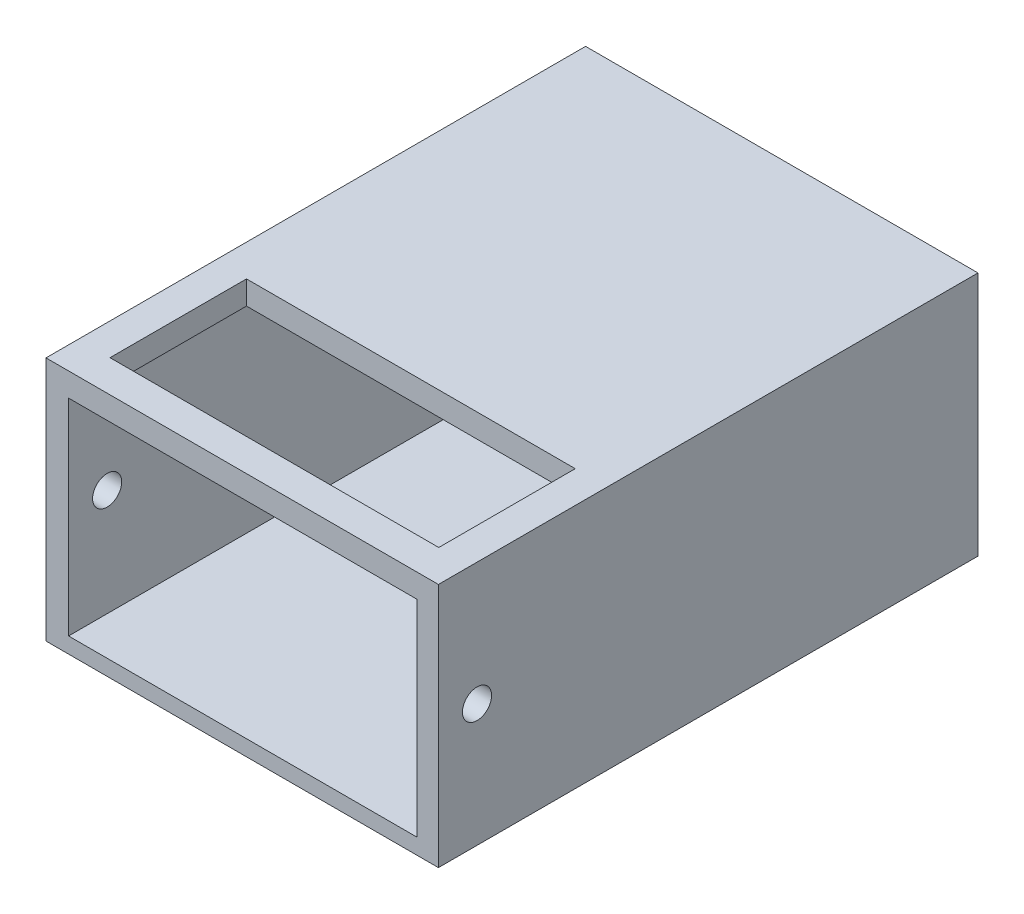
ISO-10303-21;
HEADER;
FILE_DESCRIPTION(('STEP AP214'),'2;1');
FILE_NAME('part.step','',(''),(''),'','','');
FILE_SCHEMA(('AUTOMOTIVE_DESIGN { 1 0 10303 214 1 1 1 1 }'));
ENDSEC;
DATA;
#1=APPLICATION_CONTEXT('core data for automotive mechanical design processes');
#2=APPLICATION_PROTOCOL_DEFINITION('international standard','automotive_design',2000,#1);
#3=PRODUCT_CONTEXT('',#1,'mechanical');
#4=PRODUCT('Part','Part','',(#3));
#5=PRODUCT_RELATED_PRODUCT_CATEGORY('part','',(#4));
#6=PRODUCT_DEFINITION_FORMATION('','',#4);
#7=PRODUCT_DEFINITION_CONTEXT('part definition',#1,'design');
#8=PRODUCT_DEFINITION('design','',#6,#7);
#9=PRODUCT_DEFINITION_SHAPE('','',#8);
#10=(LENGTH_UNIT() NAMED_UNIT(*) SI_UNIT(.MILLI.,.METRE.));
#11=(NAMED_UNIT(*) PLANE_ANGLE_UNIT() SI_UNIT($,.RADIAN.));
#12=(NAMED_UNIT(*) SI_UNIT($,.STERADIAN.) SOLID_ANGLE_UNIT());
#13=UNCERTAINTY_MEASURE_WITH_UNIT(LENGTH_MEASURE(1.E-05),#10,'distance_accuracy_value','');
#14=(GEOMETRIC_REPRESENTATION_CONTEXT(3) GLOBAL_UNCERTAINTY_ASSIGNED_CONTEXT((#13)) GLOBAL_UNIT_ASSIGNED_CONTEXT((#10,
#11,#12)) REPRESENTATION_CONTEXT('',''));
#15=CARTESIAN_POINT('',(0.,0.,0.));
#16=DIRECTION('',(0.,0.,1.));
#17=DIRECTION('',(1.,0.,0.));
#18=AXIS2_PLACEMENT_3D('',#15,#16,#17);
#19=CARTESIAN_POINT('',(20.,25.,-27.5));
#20=DIRECTION('',(-1.,0.,0.));
#21=DIRECTION('',(0.,0.,1.));
#22=AXIS2_PLACEMENT_3D('',#19,#20,#21);
#23=PLANE('',#22);
#24=CARTESIAN_POINT('',(20.,12.5,23.5669512691688));
#25=DIRECTION('',(-1.,0.,0.));
#26=DIRECTION('',(0.,0.,1.));
#27=AXIS2_PLACEMENT_3D('',#24,#25,#26);
#28=CIRCLE('',#27,1.48514544680534);
#29=CARTESIAN_POINT('',(20.,12.5,25.0520967159742));
#30=VERTEX_POINT('',#29);
#31=EDGE_CURVE('E178',#30,#30,#28,.T.);
#32=ORIENTED_EDGE('',*,*,#31,.T.);
#33=EDGE_LOOP('',(#32));
#34=FACE_BOUND('',#33,.T.);
#35=DIRECTION('',(0.,0.,-1.));
#36=VECTOR('',#35,1.);
#37=CARTESIAN_POINT('',(20.,0.,-27.5));
#38=LINE('',#37,#36);
#39=CARTESIAN_POINT('',(20.,0.,27.5));
#40=VERTEX_POINT('',#39);
#41=CARTESIAN_POINT('',(20.,0.,-27.5));
#42=VERTEX_POINT('',#41);
#43=EDGE_CURVE('E217',#40,#42,#38,.T.);
#44=ORIENTED_EDGE('',*,*,#43,.T.);
#45=DIRECTION('',(0.,-1.,0.));
#46=VECTOR('',#45,1.);
#47=CARTESIAN_POINT('',(20.,25.,-27.5));
#48=LINE('',#47,#46);
#49=CARTESIAN_POINT('',(20.,25.,-27.5));
#50=VERTEX_POINT('',#49);
#51=EDGE_CURVE('E264',#50,#42,#48,.T.);
#52=ORIENTED_EDGE('',*,*,#51,.F.);
#53=DIRECTION('',(0.,0.,-1.));
#54=VECTOR('',#53,1.);
#55=CARTESIAN_POINT('',(20.,25.,-27.5));
#56=LINE('',#55,#54);
#57=CARTESIAN_POINT('',(20.,25.,27.5));
#58=VERTEX_POINT('',#57);
#59=EDGE_CURVE('E227',#58,#50,#56,.T.);
#60=ORIENTED_EDGE('',*,*,#59,.F.);
#61=DIRECTION('',(0.,-1.,0.));
#62=VECTOR('',#61,1.);
#63=CARTESIAN_POINT('',(20.,25.,27.5));
#64=LINE('',#63,#62);
#65=EDGE_CURVE('E241',#58,#40,#64,.T.);
#66=ORIENTED_EDGE('',*,*,#65,.T.);
#67=EDGE_LOOP('',(#44,#52,#60,#66));
#68=FACE_BOUND('',#67,.T.);
#69=ADVANCED_FACE('F45',(#34,#68),#23,.F.);
#70=CARTESIAN_POINT('',(-20.,25.,-27.5));
#71=DIRECTION('',(0.,0.,1.));
#72=DIRECTION('',(1.,0.,0.));
#73=AXIS2_PLACEMENT_3D('',#70,#71,#72);
#74=PLANE('',#73);
#75=DIRECTION('',(-1.,0.,0.));
#76=VECTOR('',#75,1.);
#77=CARTESIAN_POINT('',(-20.,0.,-27.5));
#78=LINE('',#77,#76);
#79=CARTESIAN_POINT('',(-20.,0.,-27.5));
#80=VERTEX_POINT('',#79);
#81=EDGE_CURVE('E245',#42,#80,#78,.T.);
#82=ORIENTED_EDGE('',*,*,#81,.T.);
#83=DIRECTION('',(0.,-1.,0.));
#84=VECTOR('',#83,1.);
#85=CARTESIAN_POINT('',(-20.,25.,-27.5));
#86=LINE('',#85,#84);
#87=CARTESIAN_POINT('',(-20.,25.,-27.5));
#88=VERTEX_POINT('',#87);
#89=EDGE_CURVE('E260',#88,#80,#86,.T.);
#90=ORIENTED_EDGE('',*,*,#89,.F.);
#91=DIRECTION('',(-1.,0.,0.));
#92=VECTOR('',#91,1.);
#93=CARTESIAN_POINT('',(-20.,25.,-27.5));
#94=LINE('',#93,#92);
#95=EDGE_CURVE('E231',#50,#88,#94,.T.);
#96=ORIENTED_EDGE('',*,*,#95,.F.);
#97=ORIENTED_EDGE('',*,*,#51,.T.);
#98=EDGE_LOOP('',(#82,#90,#96,#97));
#99=FACE_BOUND('',#98,.T.);
#100=ADVANCED_FACE('F298',(#99),#74,.F.);
#101=CARTESIAN_POINT('',(-20.,25.,-27.5));
#102=DIRECTION('',(1.,0.,0.));
#103=DIRECTION('',(0.,0.,-1.));
#104=AXIS2_PLACEMENT_3D('',#101,#102,#103);
#105=PLANE('',#104);
#106=CARTESIAN_POINT('',(-20.,12.5,23.5669512691688));
#107=DIRECTION('',(-1.,0.,0.));
#108=DIRECTION('',(0.,0.,1.));
#109=AXIS2_PLACEMENT_3D('',#106,#107,#108);
#110=CIRCLE('',#109,1.48514544680534);
#111=CARTESIAN_POINT('',(-20.,12.5,25.0520967159742));
#112=VERTEX_POINT('',#111);
#113=EDGE_CURVE('E165',#112,#112,#110,.T.);
#114=ORIENTED_EDGE('',*,*,#113,.F.);
#115=EDGE_LOOP('',(#114));
#116=FACE_BOUND('',#115,.T.);
#117=DIRECTION('',(0.,0.,1.));
#118=VECTOR('',#117,1.);
#119=CARTESIAN_POINT('',(-20.,0.,-27.5));
#120=LINE('',#119,#118);
#121=CARTESIAN_POINT('',(-20.,0.,27.5));
#122=VERTEX_POINT('',#121);
#123=EDGE_CURVE('E248',#80,#122,#120,.T.);
#124=ORIENTED_EDGE('',*,*,#123,.T.);
#125=DIRECTION('',(0.,-1.,0.));
#126=VECTOR('',#125,1.);
#127=CARTESIAN_POINT('',(-20.,25.,27.5));
#128=LINE('',#127,#126);
#129=CARTESIAN_POINT('',(-20.,25.,27.5));
#130=VERTEX_POINT('',#129);
#131=EDGE_CURVE('E256',#130,#122,#128,.T.);
#132=ORIENTED_EDGE('',*,*,#131,.F.);
#133=DIRECTION('',(0.,0.,1.));
#134=VECTOR('',#133,1.);
#135=CARTESIAN_POINT('',(-20.,25.,-27.5));
#136=LINE('',#135,#134);
#137=EDGE_CURVE('E235',#88,#130,#136,.T.);
#138=ORIENTED_EDGE('',*,*,#137,.F.);
#139=ORIENTED_EDGE('',*,*,#89,.T.);
#140=EDGE_LOOP('',(#124,#132,#138,#139));
#141=FACE_BOUND('',#140,.T.);
#142=ADVANCED_FACE('F305',(#116,#141),#105,.F.);
#143=CARTESIAN_POINT('',(-20.,25.,27.5));
#144=DIRECTION('',(0.,0.,-1.));
#145=DIRECTION('',(-1.,0.,0.));
#146=AXIS2_PLACEMENT_3D('',#143,#144,#145);
#147=PLANE('',#146);
#148=DIRECTION('',(-1.,0.,0.));
#149=VECTOR('',#148,1.);
#150=CARTESIAN_POINT('',(-17.7,22.6,27.5));
#151=LINE('',#150,#149);
#152=CARTESIAN_POINT('',(17.8,22.6,27.5));
#153=VERTEX_POINT('',#152);
#154=CARTESIAN_POINT('',(-17.7,22.6,27.5));
#155=VERTEX_POINT('',#154);
#156=EDGE_CURVE('E203',#153,#155,#151,.T.);
#157=ORIENTED_EDGE('',*,*,#156,.F.);
#158=DIRECTION('',(0.,1.,0.));
#159=VECTOR('',#158,1.);
#160=CARTESIAN_POINT('',(17.8,22.6,27.5));
#161=LINE('',#160,#159);
#162=CARTESIAN_POINT('',(17.8,1.6,27.5));
#163=VERTEX_POINT('',#162);
#164=EDGE_CURVE('E182',#163,#153,#161,.T.);
#165=ORIENTED_EDGE('',*,*,#164,.F.);
#166=DIRECTION('',(1.,0.,0.));
#167=VECTOR('',#166,1.);
#168=CARTESIAN_POINT('',(-17.7,1.6,27.5));
#169=LINE('',#168,#167);
#170=CARTESIAN_POINT('',(-17.7,1.6,27.5));
#171=VERTEX_POINT('',#170);
#172=EDGE_CURVE('E188',#171,#163,#169,.T.);
#173=ORIENTED_EDGE('',*,*,#172,.F.);
#174=DIRECTION('',(0.,-1.,0.));
#175=VECTOR('',#174,1.);
#176=CARTESIAN_POINT('',(-17.7,22.6,27.5));
#177=LINE('',#176,#175);
#178=EDGE_CURVE('E207',#155,#171,#177,.T.);
#179=ORIENTED_EDGE('',*,*,#178,.F.);
#180=EDGE_LOOP('',(#157,#165,#173,#179));
#181=FACE_BOUND('',#180,.T.);
#182=DIRECTION('',(1.,0.,0.));
#183=VECTOR('',#182,1.);
#184=CARTESIAN_POINT('',(-20.,0.,27.5));
#185=LINE('',#184,#183);
#186=EDGE_CURVE('E232',#122,#40,#185,.T.);
#187=ORIENTED_EDGE('',*,*,#186,.T.);
#188=ORIENTED_EDGE('',*,*,#65,.F.);
#189=DIRECTION('',(1.,0.,0.));
#190=VECTOR('',#189,1.);
#191=CARTESIAN_POINT('',(-20.,25.,27.5));
#192=LINE('',#191,#190);
#193=EDGE_CURVE('E238',#130,#58,#192,.T.);
#194=ORIENTED_EDGE('',*,*,#193,.F.);
#195=ORIENTED_EDGE('',*,*,#131,.T.);
#196=EDGE_LOOP('',(#187,#188,#194,#195));
#197=FACE_BOUND('',#196,.T.);
#198=ADVANCED_FACE('F322',(#181,#197),#147,.F.);
#199=CARTESIAN_POINT('',(0.,25.,0.));
#200=DIRECTION('',(0.,1.,0.));
#201=DIRECTION('',(0.,0.,1.));
#202=AXIS2_PLACEMENT_3D('',#199,#200,#201);
#203=PLANE('',#202);
#204=DIRECTION('',(0.,0.,-1.));
#205=VECTOR('',#204,1.);
#206=CARTESIAN_POINT('',(16.7550361228076,25.,10.3075285514993));
#207=LINE('',#206,#205);
#208=CARTESIAN_POINT('',(16.7550361228076,25.,24.2205712053749));
#209=VERTEX_POINT('',#208);
#210=CARTESIAN_POINT('',(16.7550361228076,25.,10.3075285514993));
#211=VERTEX_POINT('',#210);
#212=EDGE_CURVE('E60',#209,#211,#207,.T.);
#213=ORIENTED_EDGE('',*,*,#212,.F.);
#214=DIRECTION('',(1.,0.,0.));
#215=VECTOR('',#214,1.);
#216=CARTESIAN_POINT('',(-16.7550361228076,25.,24.2205712053749));
#217=LINE('',#216,#215);
#218=CARTESIAN_POINT('',(-16.7550361228076,25.,24.2205712053749));
#219=VERTEX_POINT('',#218);
#220=EDGE_CURVE('E155',#219,#209,#217,.T.);
#221=ORIENTED_EDGE('',*,*,#220,.F.);
#222=DIRECTION('',(0.,0.,1.));
#223=VECTOR('',#222,1.);
#224=CARTESIAN_POINT('',(-16.7550361228076,25.,10.3075285514993));
#225=LINE('',#224,#223);
#226=CARTESIAN_POINT('',(-16.7550361228076,25.,10.3075285514993));
#227=VERTEX_POINT('',#226);
#228=EDGE_CURVE('E137',#227,#219,#225,.T.);
#229=ORIENTED_EDGE('',*,*,#228,.F.);
#230=DIRECTION('',(-1.,0.,0.));
#231=VECTOR('',#230,1.);
#232=CARTESIAN_POINT('',(-16.7550361228076,25.,10.3075285514993));
#233=LINE('',#232,#231);
#234=EDGE_CURVE('E147',#211,#227,#233,.T.);
#235=ORIENTED_EDGE('',*,*,#234,.F.);
#236=EDGE_LOOP('',(#213,#221,#229,#235));
#237=FACE_BOUND('',#236,.T.);
#238=ORIENTED_EDGE('',*,*,#59,.T.);
#239=ORIENTED_EDGE('',*,*,#95,.T.);
#240=ORIENTED_EDGE('',*,*,#137,.T.);
#241=ORIENTED_EDGE('',*,*,#193,.T.);
#242=EDGE_LOOP('',(#238,#239,#240,#241));
#243=FACE_BOUND('',#242,.T.);
#244=ADVANCED_FACE('F152',(#237,#243),#203,.T.);
#245=CARTESIAN_POINT('',(0.,0.,0.));
#246=DIRECTION('',(0.,1.,0.));
#247=DIRECTION('',(0.,0.,1.));
#248=AXIS2_PLACEMENT_3D('',#245,#246,#247);
#249=PLANE('',#248);
#250=ORIENTED_EDGE('',*,*,#43,.F.);
#251=ORIENTED_EDGE('',*,*,#186,.F.);
#252=ORIENTED_EDGE('',*,*,#123,.F.);
#253=ORIENTED_EDGE('',*,*,#81,.F.);
#254=EDGE_LOOP('',(#250,#251,#252,#253));
#255=FACE_BOUND('',#254,.T.);
#256=ADVANCED_FACE('F315',(#255),#249,.F.);
#257=CARTESIAN_POINT('',(17.8,22.6,-25.));
#258=DIRECTION('',(1.,0.,0.));
#259=DIRECTION('',(0.,1.,0.));
#260=AXIS2_PLACEMENT_3D('',#257,#258,#259);
#261=PLANE('',#260);
#262=CARTESIAN_POINT('',(17.8,12.5,23.5669512691688));
#263=DIRECTION('',(1.,0.,0.));
#264=DIRECTION('',(0.,1.,0.));
#265=AXIS2_PLACEMENT_3D('',#262,#263,#264);
#266=CIRCLE('',#265,1.48514544680534);
#267=CARTESIAN_POINT('',(17.8,13.9851454468053,23.5669512691688));
#268=VERTEX_POINT('',#267);
#269=EDGE_CURVE('E174',#268,#268,#266,.T.);
#270=ORIENTED_EDGE('',*,*,#269,.T.);
#271=EDGE_LOOP('',(#270));
#272=FACE_BOUND('',#271,.T.);
#273=ORIENTED_EDGE('',*,*,#164,.T.);
#274=DIRECTION('',(0.,0.,1.));
#275=VECTOR('',#274,1.);
#276=CARTESIAN_POINT('',(17.8,22.6,-25.));
#277=LINE('',#276,#275);
#278=CARTESIAN_POINT('',(17.8,22.6,-25.));
#279=VERTEX_POINT('',#278);
#280=EDGE_CURVE('E200',#279,#153,#277,.T.);
#281=ORIENTED_EDGE('',*,*,#280,.F.);
#282=DIRECTION('',(0.,1.,0.));
#283=VECTOR('',#282,1.);
#284=CARTESIAN_POINT('',(17.8,22.6,-25.));
#285=LINE('',#284,#283);
#286=CARTESIAN_POINT('',(17.8,1.6,-25.));
#287=VERTEX_POINT('',#286);
#288=EDGE_CURVE('E183',#287,#279,#285,.T.);
#289=ORIENTED_EDGE('',*,*,#288,.F.);
#290=DIRECTION('',(0.,0.,1.));
#291=VECTOR('',#290,1.);
#292=CARTESIAN_POINT('',(17.8,1.6,-25.));
#293=LINE('',#292,#291);
#294=EDGE_CURVE('E214',#287,#163,#293,.T.);
#295=ORIENTED_EDGE('',*,*,#294,.T.);
#296=EDGE_LOOP('',(#273,#281,#289,#295));
#297=FACE_BOUND('',#296,.T.);
#298=ADVANCED_FACE('F336',(#272,#297),#261,.F.);
#299=CARTESIAN_POINT('',(-17.7,1.6,-25.));
#300=DIRECTION('',(0.,-1.,0.));
#301=DIRECTION('',(0.,0.,-1.));
#302=AXIS2_PLACEMENT_3D('',#299,#300,#301);
#303=PLANE('',#302);
#304=ORIENTED_EDGE('',*,*,#172,.T.);
#305=ORIENTED_EDGE('',*,*,#294,.F.);
#306=DIRECTION('',(1.,0.,0.));
#307=VECTOR('',#306,1.);
#308=CARTESIAN_POINT('',(-17.7,1.6,-25.));
#309=LINE('',#308,#307);
#310=CARTESIAN_POINT('',(-17.7,1.6,-25.));
#311=VERTEX_POINT('',#310);
#312=EDGE_CURVE('E196',#311,#287,#309,.T.);
#313=ORIENTED_EDGE('',*,*,#312,.F.);
#314=DIRECTION('',(0.,0.,1.));
#315=VECTOR('',#314,1.);
#316=CARTESIAN_POINT('',(-17.7,1.6,-25.));
#317=LINE('',#316,#315);
#318=EDGE_CURVE('E218',#311,#171,#317,.T.);
#319=ORIENTED_EDGE('',*,*,#318,.T.);
#320=EDGE_LOOP('',(#304,#305,#313,#319));
#321=FACE_BOUND('',#320,.T.);
#322=ADVANCED_FACE('F340',(#321),#303,.F.);
#323=CARTESIAN_POINT('',(-17.7,22.6,-25.));
#324=DIRECTION('',(-1.,0.,0.));
#325=DIRECTION('',(0.,-1.,0.));
#326=AXIS2_PLACEMENT_3D('',#323,#324,#325);
#327=PLANE('',#326);
#328=CARTESIAN_POINT('',(-17.7,12.5,23.5669512691688));
#329=DIRECTION('',(-1.,0.,0.));
#330=DIRECTION('',(0.,-1.,0.));
#331=AXIS2_PLACEMENT_3D('',#328,#329,#330);
#332=CIRCLE('',#331,1.48514544680534);
#333=CARTESIAN_POINT('',(-17.7,11.0148545531947,23.5669512691688));
#334=VERTEX_POINT('',#333);
#335=EDGE_CURVE('E173',#334,#334,#332,.T.);
#336=ORIENTED_EDGE('',*,*,#335,.T.);
#337=EDGE_LOOP('',(#336));
#338=FACE_BOUND('',#337,.T.);
#339=ORIENTED_EDGE('',*,*,#178,.T.);
#340=ORIENTED_EDGE('',*,*,#318,.F.);
#341=DIRECTION('',(0.,-1.,0.));
#342=VECTOR('',#341,1.);
#343=CARTESIAN_POINT('',(-17.7,22.6,-25.));
#344=LINE('',#343,#342);
#345=CARTESIAN_POINT('',(-17.7,22.6,-25.));
#346=VERTEX_POINT('',#345);
#347=EDGE_CURVE('E192',#346,#311,#344,.T.);
#348=ORIENTED_EDGE('',*,*,#347,.F.);
#349=DIRECTION('',(0.,0.,1.));
#350=VECTOR('',#349,1.);
#351=CARTESIAN_POINT('',(-17.7,22.6,-25.));
#352=LINE('',#351,#350);
#353=EDGE_CURVE('E221',#346,#155,#352,.T.);
#354=ORIENTED_EDGE('',*,*,#353,.T.);
#355=EDGE_LOOP('',(#339,#340,#348,#354));
#356=FACE_BOUND('',#355,.T.);
#357=ADVANCED_FACE('F344',(#338,#356),#327,.F.);
#358=CARTESIAN_POINT('',(-17.7,22.6,-25.));
#359=DIRECTION('',(0.,1.,0.));
#360=DIRECTION('',(0.,0.,1.));
#361=AXIS2_PLACEMENT_3D('',#358,#359,#360);
#362=PLANE('',#361);
#363=DIRECTION('',(1.,0.,0.));
#364=VECTOR('',#363,1.);
#365=CARTESIAN_POINT('',(-17.7,22.6,24.2205712053749));
#366=LINE('',#365,#364);
#367=CARTESIAN_POINT('',(-16.7550361228076,22.6,24.2205712053749));
#368=VERTEX_POINT('',#367);
#369=CARTESIAN_POINT('',(16.7550361228076,22.6,24.2205712053749));
#370=VERTEX_POINT('',#369);
#371=EDGE_CURVE('E53',#368,#370,#366,.T.);
#372=ORIENTED_EDGE('',*,*,#371,.T.);
#373=DIRECTION('',(0.,0.,-1.));
#374=VECTOR('',#373,1.);
#375=CARTESIAN_POINT('',(16.7550361228076,22.6,-25.));
#376=LINE('',#375,#374);
#377=CARTESIAN_POINT('',(16.7550361228076,22.6,10.3075285514993));
#378=VERTEX_POINT('',#377);
#379=EDGE_CURVE('E11',#370,#378,#376,.T.);
#380=ORIENTED_EDGE('',*,*,#379,.T.);
#381=DIRECTION('',(-1.,0.,0.));
#382=VECTOR('',#381,1.);
#383=CARTESIAN_POINT('',(-17.7,22.6,10.3075285514993));
#384=LINE('',#383,#382);
#385=CARTESIAN_POINT('',(-16.7550361228076,22.6,10.3075285514993));
#386=VERTEX_POINT('',#385);
#387=EDGE_CURVE('E268',#378,#386,#384,.T.);
#388=ORIENTED_EDGE('',*,*,#387,.T.);
#389=DIRECTION('',(0.,0.,1.));
#390=VECTOR('',#389,1.);
#391=CARTESIAN_POINT('',(-16.7550361228076,22.6,-25.));
#392=LINE('',#391,#390);
#393=EDGE_CURVE('E140',#386,#368,#392,.T.);
#394=ORIENTED_EDGE('',*,*,#393,.T.);
#395=EDGE_LOOP('',(#372,#380,#388,#394));
#396=FACE_BOUND('',#395,.T.);
#397=ORIENTED_EDGE('',*,*,#156,.T.);
#398=ORIENTED_EDGE('',*,*,#353,.F.);
#399=DIRECTION('',(-1.,0.,0.));
#400=VECTOR('',#399,1.);
#401=CARTESIAN_POINT('',(-17.7,22.6,-25.));
#402=LINE('',#401,#400);
#403=EDGE_CURVE('E187',#279,#346,#402,.T.);
#404=ORIENTED_EDGE('',*,*,#403,.F.);
#405=ORIENTED_EDGE('',*,*,#280,.T.);
#406=EDGE_LOOP('',(#397,#398,#404,#405));
#407=FACE_BOUND('',#406,.T.);
#408=ADVANCED_FACE('F278',(#396,#407),#362,.F.);
#409=CARTESIAN_POINT('',(0.,0.,-25.));
#410=DIRECTION('',(0.,0.,1.));
#411=DIRECTION('',(1.,0.,0.));
#412=AXIS2_PLACEMENT_3D('',#409,#410,#411);
#413=PLANE('',#412);
#414=ORIENTED_EDGE('',*,*,#288,.T.);
#415=ORIENTED_EDGE('',*,*,#403,.T.);
#416=ORIENTED_EDGE('',*,*,#347,.T.);
#417=ORIENTED_EDGE('',*,*,#312,.T.);
#418=EDGE_LOOP('',(#414,#415,#416,#417));
#419=FACE_BOUND('',#418,.T.);
#420=ADVANCED_FACE('F343',(#419),#413,.T.);
#421=CARTESIAN_POINT('',(32.5,12.5,23.5669512691688));
#422=DIRECTION('',(-1.,0.,0.));
#423=DIRECTION('',(0.,0.,1.));
#424=AXIS2_PLACEMENT_3D('',#421,#422,#423);
#425=CYLINDRICAL_SURFACE('',#424,1.48514544680534);
#426=ORIENTED_EDGE('',*,*,#113,.T.);
#427=EDGE_LOOP('',(#426));
#428=FACE_BOUND('',#427,.T.);
#429=ORIENTED_EDGE('',*,*,#335,.F.);
#430=EDGE_LOOP('',(#429));
#431=FACE_BOUND('',#430,.T.);
#432=ADVANCED_FACE('F293',(#428,#431),#425,.F.);
#433=ORIENTED_EDGE('',*,*,#269,.F.);
#434=EDGE_LOOP('',(#433));
#435=FACE_BOUND('',#434,.T.);
#436=ORIENTED_EDGE('',*,*,#31,.F.);
#437=EDGE_LOOP('',(#436));
#438=FACE_BOUND('',#437,.T.);
#439=ADVANCED_FACE('F285',(#435,#438),#425,.F.);
#440=CARTESIAN_POINT('',(16.7550361228076,5.,10.3075285514993));
#441=DIRECTION('',(1.,0.,0.));
#442=DIRECTION('',(0.,0.,-1.));
#443=AXIS2_PLACEMENT_3D('',#440,#441,#442);
#444=PLANE('',#443);
#445=DIRECTION('',(0.,1.,0.));
#446=VECTOR('',#445,1.);
#447=CARTESIAN_POINT('',(16.7550361228076,5.,24.2205712053749));
#448=LINE('',#447,#446);
#449=EDGE_CURVE('E162',#370,#209,#448,.T.);
#450=ORIENTED_EDGE('',*,*,#449,.T.);
#451=ORIENTED_EDGE('',*,*,#212,.T.);
#452=DIRECTION('',(0.,1.,0.));
#453=VECTOR('',#452,1.);
#454=CARTESIAN_POINT('',(16.7550361228076,5.,10.3075285514993));
#455=LINE('',#454,#453);
#456=EDGE_CURVE('E144',#378,#211,#455,.T.);
#457=ORIENTED_EDGE('',*,*,#456,.F.);
#458=ORIENTED_EDGE('',*,*,#379,.F.);
#459=EDGE_LOOP('',(#450,#451,#457,#458));
#460=FACE_BOUND('',#459,.T.);
#461=ADVANCED_FACE('F283',(#460),#444,.F.);
#462=CARTESIAN_POINT('',(-16.7550361228076,5.,24.2205712053749));
#463=DIRECTION('',(0.,0.,1.));
#464=DIRECTION('',(1.,0.,0.));
#465=AXIS2_PLACEMENT_3D('',#462,#463,#464);
#466=PLANE('',#465);
#467=DIRECTION('',(0.,1.,0.));
#468=VECTOR('',#467,1.);
#469=CARTESIAN_POINT('',(-16.7550361228076,5.,24.2205712053749));
#470=LINE('',#469,#468);
#471=EDGE_CURVE('E143',#368,#219,#470,.T.);
#472=ORIENTED_EDGE('',*,*,#471,.T.);
#473=ORIENTED_EDGE('',*,*,#220,.T.);
#474=ORIENTED_EDGE('',*,*,#449,.F.);
#475=ORIENTED_EDGE('',*,*,#371,.F.);
#476=EDGE_LOOP('',(#472,#473,#474,#475));
#477=FACE_BOUND('',#476,.T.);
#478=ADVANCED_FACE('F282',(#477),#466,.F.);
#479=CARTESIAN_POINT('',(-16.7550361228076,5.,10.3075285514993));
#480=DIRECTION('',(-1.,0.,0.));
#481=DIRECTION('',(0.,0.,1.));
#482=AXIS2_PLACEMENT_3D('',#479,#480,#481);
#483=PLANE('',#482);
#484=DIRECTION('',(0.,1.,0.));
#485=VECTOR('',#484,1.);
#486=CARTESIAN_POINT('',(-16.7550361228076,5.,10.3075285514993));
#487=LINE('',#486,#485);
#488=EDGE_CURVE('E68',#386,#227,#487,.T.);
#489=ORIENTED_EDGE('',*,*,#488,.T.);
#490=ORIENTED_EDGE('',*,*,#228,.T.);
#491=ORIENTED_EDGE('',*,*,#471,.F.);
#492=ORIENTED_EDGE('',*,*,#393,.F.);
#493=EDGE_LOOP('',(#489,#490,#491,#492));
#494=FACE_BOUND('',#493,.T.);
#495=ADVANCED_FACE('F134',(#494),#483,.F.);
#496=CARTESIAN_POINT('',(-16.7550361228076,5.,10.3075285514993));
#497=DIRECTION('',(0.,0.,-1.));
#498=DIRECTION('',(-1.,0.,0.));
#499=AXIS2_PLACEMENT_3D('',#496,#497,#498);
#500=PLANE('',#499);
#501=ORIENTED_EDGE('',*,*,#456,.T.);
#502=ORIENTED_EDGE('',*,*,#234,.T.);
#503=ORIENTED_EDGE('',*,*,#488,.F.);
#504=ORIENTED_EDGE('',*,*,#387,.F.);
#505=EDGE_LOOP('',(#501,#502,#503,#504));
#506=FACE_BOUND('',#505,.T.);
#507=ADVANCED_FACE('F148',(#506),#500,.F.);
#508=CLOSED_SHELL('',(#69,#100,#142,#198,#244,#256,#298,#322,#357,#408,#420,#432,#439,#461,#478,
#495,#507));
#509=MANIFOLD_SOLID_BREP('B2',#508);
#510=ADVANCED_BREP_SHAPE_REPRESENTATION('',(#18,#509),#14);
#511=SHAPE_DEFINITION_REPRESENTATION(#9,#510);
ENDSEC;
END-ISO-10303-21;
